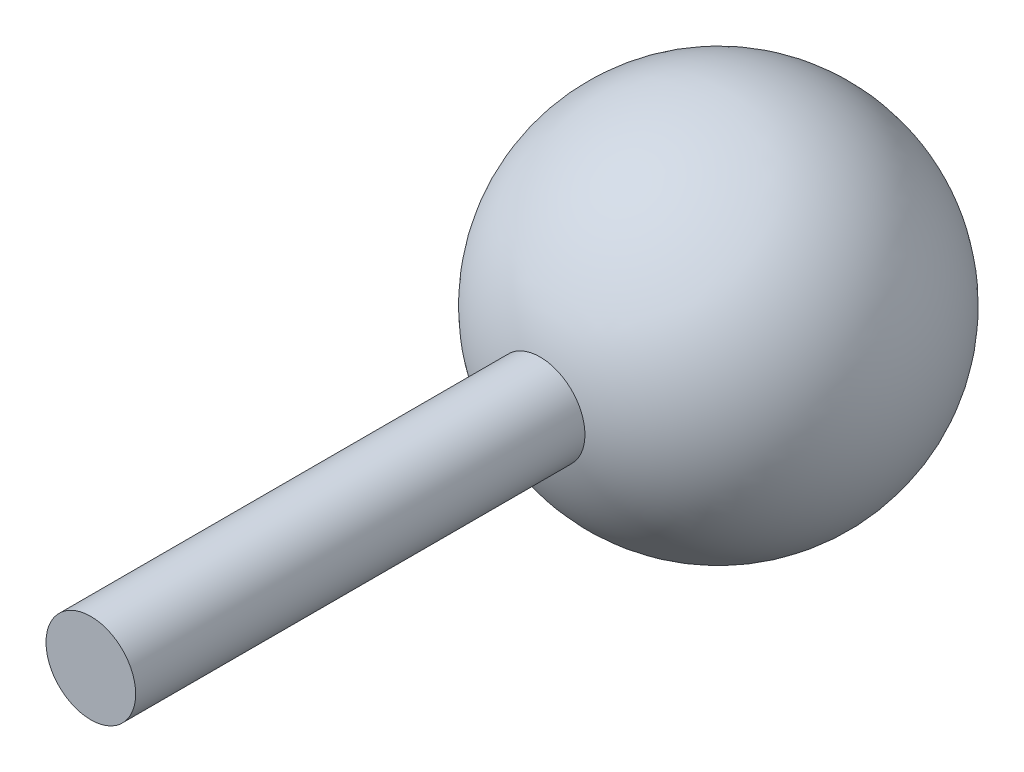
ISO-10303-21;
HEADER;
FILE_DESCRIPTION(('STEP AP214'),'2;1');
FILE_NAME('part.step','',(''),(''),'','','');
FILE_SCHEMA(('AUTOMOTIVE_DESIGN { 1 0 10303 214 1 1 1 1 }'));
ENDSEC;
DATA;
#1=APPLICATION_CONTEXT('core data for automotive mechanical design processes');
#2=APPLICATION_PROTOCOL_DEFINITION('international standard','automotive_design',2000,#1);
#3=PRODUCT_CONTEXT('',#1,'mechanical');
#4=PRODUCT('Part','Part','',(#3));
#5=PRODUCT_RELATED_PRODUCT_CATEGORY('part','',(#4));
#6=PRODUCT_DEFINITION_FORMATION('','',#4);
#7=PRODUCT_DEFINITION_CONTEXT('part definition',#1,'design');
#8=PRODUCT_DEFINITION('design','',#6,#7);
#9=PRODUCT_DEFINITION_SHAPE('','',#8);
#10=(LENGTH_UNIT() NAMED_UNIT(*) SI_UNIT(.MILLI.,.METRE.));
#11=(NAMED_UNIT(*) PLANE_ANGLE_UNIT() SI_UNIT($,.RADIAN.));
#12=(NAMED_UNIT(*) SI_UNIT($,.STERADIAN.) SOLID_ANGLE_UNIT());
#13=UNCERTAINTY_MEASURE_WITH_UNIT(LENGTH_MEASURE(1.E-05),#10,'distance_accuracy_value','');
#14=(GEOMETRIC_REPRESENTATION_CONTEXT(3) GLOBAL_UNCERTAINTY_ASSIGNED_CONTEXT((#13)) GLOBAL_UNIT_ASSIGNED_CONTEXT((#10,
#11,#12)) REPRESENTATION_CONTEXT('',''));
#15=CARTESIAN_POINT('',(0.,0.,0.));
#16=DIRECTION('',(0.,0.,1.));
#17=DIRECTION('',(1.,0.,0.));
#18=AXIS2_PLACEMENT_3D('',#15,#16,#17);
#19=CARTESIAN_POINT('',(0.,0.,140.));
#20=DIRECTION('',(0.,0.,-1.));
#21=DIRECTION('',(-1.,0.,0.));
#22=AXIS2_PLACEMENT_3D('',#19,#20,#21);
#23=CYLINDRICAL_SURFACE('',#22,10.);
#24=CARTESIAN_POINT('',(0.,0.,39.7617907041421));
#25=DIRECTION('',(0.,0.,-1.));
#26=DIRECTION('',(-1.,0.,0.));
#27=AXIS2_PLACEMENT_3D('',#24,#25,#26);
#28=CIRCLE('',#27,10.);
#29=CARTESIAN_POINT('',(-10.,0.,39.7617907041421));
#30=VERTEX_POINT('',#29);
#31=EDGE_CURVE('E10',#30,#30,#28,.T.);
#32=ORIENTED_EDGE('',*,*,#31,.F.);
#33=EDGE_LOOP('',(#32));
#34=FACE_BOUND('',#33,.T.);
#35=CARTESIAN_POINT('',(0.,0.,140.));
#36=DIRECTION('',(0.,0.,1.));
#37=DIRECTION('',(1.,0.,0.));
#38=AXIS2_PLACEMENT_3D('',#35,#36,#37);
#39=CIRCLE('',#38,10.);
#40=CARTESIAN_POINT('',(10.,0.,140.));
#41=VERTEX_POINT('',#40);
#42=EDGE_CURVE('E46',#41,#41,#39,.T.);
#43=ORIENTED_EDGE('',*,*,#42,.F.);
#44=EDGE_LOOP('',(#43));
#45=FACE_BOUND('',#44,.T.);
#46=ADVANCED_FACE('F39',(#34,#45),#23,.T.);
#47=CARTESIAN_POINT('',(0.,0.,140.));
#48=DIRECTION('',(0.,0.,1.));
#49=DIRECTION('',(1.,0.,0.));
#50=AXIS2_PLACEMENT_3D('',#47,#48,#49);
#51=PLANE('',#50);
#52=ORIENTED_EDGE('',*,*,#42,.T.);
#53=EDGE_LOOP('',(#52));
#54=FACE_BOUND('',#53,.T.);
#55=ADVANCED_FACE('F52',(#54),#51,.T.);
#56=CARTESIAN_POINT('',(0.,0.,0.));
#57=DIRECTION('',(0.,1.,0.));
#58=DIRECTION('',(1.,0.,0.));
#59=AXIS2_PLACEMENT_3D('',#56,#57,#58);
#60=SPHERICAL_SURFACE('',#59,41.);
#61=CARTESIAN_POINT('',(0.,0.,0.));
#62=DIRECTION('',(0.,0.,-1.));
#63=DIRECTION('',(-1.,0.,0.));
#64=AXIS2_PLACEMENT_3D('',#61,#62,#63);
#65=SPHERICAL_SURFACE('',#64,41.);
#66=ORIENTED_EDGE('',*,*,#31,.T.);
#67=EDGE_LOOP('',(#66));
#68=FACE_BOUND('',#67,.T.);
#69=ADVANCED_FACE('F41',(#68),#65,.T.);
#70=CLOSED_SHELL('',(#46,#55,#69));
#71=MANIFOLD_SOLID_BREP('B2',#70);
#72=ADVANCED_BREP_SHAPE_REPRESENTATION('',(#18,#71),#14);
#73=SHAPE_DEFINITION_REPRESENTATION(#9,#72);
ENDSEC;
END-ISO-10303-21;
